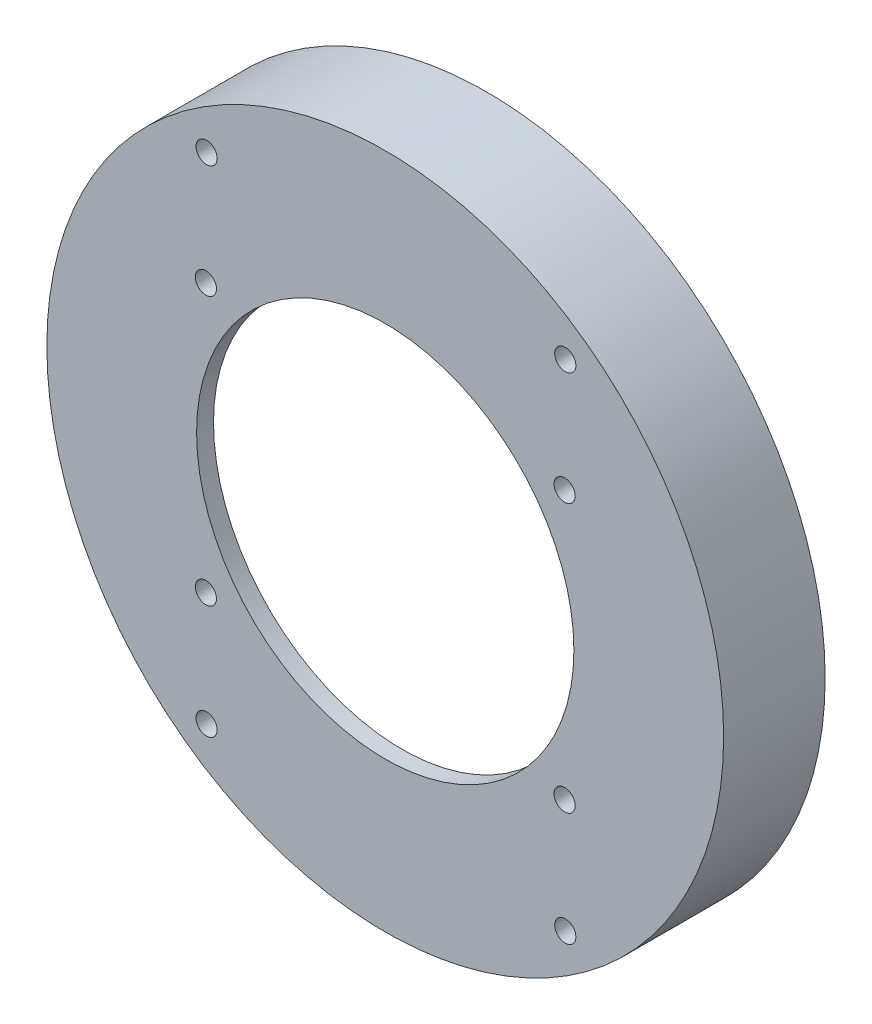
ISO-10303-21;
HEADER;
FILE_DESCRIPTION(('STEP AP214'),'2;1');
FILE_NAME('part.step','',(''),(''),'','','');
FILE_SCHEMA(('AUTOMOTIVE_DESIGN { 1 0 10303 214 1 1 1 1 }'));
ENDSEC;
DATA;
#1=APPLICATION_CONTEXT('core data for automotive mechanical design processes');
#2=APPLICATION_PROTOCOL_DEFINITION('international standard','automotive_design',2000,#1);
#3=PRODUCT_CONTEXT('',#1,'mechanical');
#4=PRODUCT('Part','Part','',(#3));
#5=PRODUCT_RELATED_PRODUCT_CATEGORY('part','',(#4));
#6=PRODUCT_DEFINITION_FORMATION('','',#4);
#7=PRODUCT_DEFINITION_CONTEXT('part definition',#1,'design');
#8=PRODUCT_DEFINITION('design','',#6,#7);
#9=PRODUCT_DEFINITION_SHAPE('','',#8);
#10=(LENGTH_UNIT() NAMED_UNIT(*) SI_UNIT(.MILLI.,.METRE.));
#11=(NAMED_UNIT(*) PLANE_ANGLE_UNIT() SI_UNIT($,.RADIAN.));
#12=(NAMED_UNIT(*) SI_UNIT($,.STERADIAN.) SOLID_ANGLE_UNIT());
#13=UNCERTAINTY_MEASURE_WITH_UNIT(LENGTH_MEASURE(1.E-05),#10,'distance_accuracy_value','');
#14=(GEOMETRIC_REPRESENTATION_CONTEXT(3) GLOBAL_UNCERTAINTY_ASSIGNED_CONTEXT((#13)) GLOBAL_UNIT_ASSIGNED_CONTEXT((#10,
#11,#12)) REPRESENTATION_CONTEXT('',''));
#15=CARTESIAN_POINT('',(0.,0.,0.));
#16=DIRECTION('',(0.,0.,1.));
#17=DIRECTION('',(1.,0.,0.));
#18=AXIS2_PLACEMENT_3D('',#15,#16,#17);
#19=CARTESIAN_POINT('',(0.,0.,25.908));
#20=DIRECTION('',(0.,0.,-1.));
#21=DIRECTION('',(-1.,0.,0.));
#22=AXIS2_PLACEMENT_3D('',#19,#20,#21);
#23=CYLINDRICAL_SURFACE('',#22,56.642);
#24=CARTESIAN_POINT('',(0.,0.,5.08));
#25=DIRECTION('',(0.,0.,1.));
#26=DIRECTION('',(1.,0.,0.));
#27=AXIS2_PLACEMENT_3D('',#24,#25,#26);
#28=CIRCLE('',#27,56.642);
#29=CARTESIAN_POINT('',(56.642,0.,5.08));
#30=VERTEX_POINT('',#29);
#31=EDGE_CURVE('E49',#30,#30,#28,.T.);
#32=ORIENTED_EDGE('',*,*,#31,.T.);
#33=EDGE_LOOP('',(#32));
#34=FACE_BOUND('',#33,.T.);
#35=CARTESIAN_POINT('',(0.,0.,0.));
#36=DIRECTION('',(0.,0.,-1.));
#37=DIRECTION('',(-1.,0.,0.));
#38=AXIS2_PLACEMENT_3D('',#35,#36,#37);
#39=CIRCLE('',#38,56.642);
#40=CARTESIAN_POINT('',(-56.642,0.,0.));
#41=VERTEX_POINT('',#40);
#42=EDGE_CURVE('E94',#41,#41,#39,.T.);
#43=ORIENTED_EDGE('',*,*,#42,.T.);
#44=EDGE_LOOP('',(#43));
#45=FACE_BOUND('',#44,.T.);
#46=ADVANCED_FACE('F40',(#34,#45),#23,.F.);
#47=CARTESIAN_POINT('',(0.,0.,5.08));
#48=DIRECTION('',(0.,0.,-1.));
#49=DIRECTION('',(-1.,0.,0.));
#50=AXIS2_PLACEMENT_3D('',#47,#48,#49);
#51=CYLINDRICAL_SURFACE('',#50,101.6);
#52=CARTESIAN_POINT('',(0.,0.,5.08));
#53=DIRECTION('',(0.,0.,1.));
#54=DIRECTION('',(1.,0.,0.));
#55=AXIS2_PLACEMENT_3D('',#52,#53,#54);
#56=CIRCLE('',#55,101.6);
#57=CARTESIAN_POINT('',(101.6,0.,5.08));
#58=VERTEX_POINT('',#57);
#59=EDGE_CURVE('E10',#58,#58,#56,.T.);
#60=ORIENTED_EDGE('',*,*,#59,.F.);
#61=EDGE_LOOP('',(#60));
#62=FACE_BOUND('',#61,.T.);
#63=CARTESIAN_POINT('',(0.,0.,-25.4));
#64=DIRECTION('',(0.,0.,-1.));
#65=DIRECTION('',(-1.,0.,0.));
#66=AXIS2_PLACEMENT_3D('',#63,#64,#65);
#67=CIRCLE('',#66,101.6);
#68=CARTESIAN_POINT('',(-101.6,0.,-25.4));
#69=VERTEX_POINT('',#68);
#70=EDGE_CURVE('E44',#69,#69,#67,.T.);
#71=ORIENTED_EDGE('',*,*,#70,.F.);
#72=EDGE_LOOP('',(#71));
#73=FACE_BOUND('',#72,.T.);
#74=ADVANCED_FACE('F39',(#62,#73),#51,.T.);
#75=CARTESIAN_POINT('',(0.,0.,5.08));
#76=DIRECTION('',(0.,0.,1.));
#77=DIRECTION('',(1.,0.,0.));
#78=AXIS2_PLACEMENT_3D('',#75,#76,#77);
#79=PLANE('',#78);
#80=CARTESIAN_POINT('',(54.0557691116327,-74.2958357456069,5.08));
#81=DIRECTION('',(0.,0.,1.));
#82=DIRECTION('',(1.,0.,0.));
#83=AXIS2_PLACEMENT_3D('',#80,#81,#82);
#84=CIRCLE('',#83,3.175);
#85=CARTESIAN_POINT('',(57.2307691116327,-74.2958357456069,5.08));
#86=VERTEX_POINT('',#85);
#87=EDGE_CURVE('E172',#86,#86,#84,.T.);
#88=ORIENTED_EDGE('',*,*,#87,.F.);
#89=EDGE_LOOP('',(#88));
#90=FACE_BOUND('',#89,.T.);
#91=CARTESIAN_POINT('',(-53.6402308883673,-74.295835745607,5.08));
#92=DIRECTION('',(0.,0.,1.));
#93=DIRECTION('',(1.,0.,0.));
#94=AXIS2_PLACEMENT_3D('',#91,#92,#93);
#95=CIRCLE('',#94,3.175);
#96=CARTESIAN_POINT('',(-50.4652308883673,-74.295835745607,5.08));
#97=VERTEX_POINT('',#96);
#98=EDGE_CURVE('E166',#97,#97,#95,.T.);
#99=ORIENTED_EDGE('',*,*,#98,.F.);
#100=EDGE_LOOP('',(#99));
#101=FACE_BOUND('',#100,.T.);
#102=CARTESIAN_POINT('',(-53.6402308883673,74.294164254393,5.08));
#103=DIRECTION('',(0.,0.,1.));
#104=DIRECTION('',(1.,0.,0.));
#105=AXIS2_PLACEMENT_3D('',#102,#103,#104);
#106=CIRCLE('',#105,3.175);
#107=CARTESIAN_POINT('',(-50.4652308883673,74.294164254393,5.08));
#108=VERTEX_POINT('',#107);
#109=EDGE_CURVE('E170',#108,#108,#106,.T.);
#110=ORIENTED_EDGE('',*,*,#109,.F.);
#111=EDGE_LOOP('',(#110));
#112=FACE_BOUND('',#111,.T.);
#113=CARTESIAN_POINT('',(54.0557691116327,74.2941642543931,5.08));
#114=DIRECTION('',(0.,0.,1.));
#115=DIRECTION('',(1.,0.,0.));
#116=AXIS2_PLACEMENT_3D('',#113,#114,#115);
#117=CIRCLE('',#116,3.175);
#118=CARTESIAN_POINT('',(57.2307691116327,74.2941642543931,5.08));
#119=VERTEX_POINT('',#118);
#120=EDGE_CURVE('E59',#119,#119,#117,.T.);
#121=ORIENTED_EDGE('',*,*,#120,.F.);
#122=EDGE_LOOP('',(#121));
#123=FACE_BOUND('',#122,.T.);
#124=CARTESIAN_POINT('',(-53.848,-40.259,5.08));
#125=DIRECTION('',(0.,0.,1.));
#126=DIRECTION('',(1.,0.,0.));
#127=AXIS2_PLACEMENT_3D('',#124,#125,#126);
#128=CIRCLE('',#127,3.175);
#129=CARTESIAN_POINT('',(-50.673,-40.259,5.08));
#130=VERTEX_POINT('',#129);
#131=EDGE_CURVE('E88',#130,#130,#128,.T.);
#132=ORIENTED_EDGE('',*,*,#131,.F.);
#133=EDGE_LOOP('',(#132));
#134=FACE_BOUND('',#133,.T.);
#135=CARTESIAN_POINT('',(53.848,-40.259,5.08));
#136=DIRECTION('',(0.,0.,1.));
#137=DIRECTION('',(1.,0.,0.));
#138=AXIS2_PLACEMENT_3D('',#135,#136,#137);
#139=CIRCLE('',#138,3.175);
#140=CARTESIAN_POINT('',(57.023,-40.259,5.08));
#141=VERTEX_POINT('',#140);
#142=EDGE_CURVE('E90',#141,#141,#139,.T.);
#143=ORIENTED_EDGE('',*,*,#142,.F.);
#144=EDGE_LOOP('',(#143));
#145=FACE_BOUND('',#144,.T.);
#146=CARTESIAN_POINT('',(53.848,40.259,5.08));
#147=DIRECTION('',(0.,0.,1.));
#148=DIRECTION('',(1.,0.,0.));
#149=AXIS2_PLACEMENT_3D('',#146,#147,#148);
#150=CIRCLE('',#149,3.175);
#151=CARTESIAN_POINT('',(57.023,40.259,5.08));
#152=VERTEX_POINT('',#151);
#153=EDGE_CURVE('E84',#152,#152,#150,.T.);
#154=ORIENTED_EDGE('',*,*,#153,.F.);
#155=EDGE_LOOP('',(#154));
#156=FACE_BOUND('',#155,.T.);
#157=CARTESIAN_POINT('',(-53.848,40.259,5.08));
#158=DIRECTION('',(0.,0.,1.));
#159=DIRECTION('',(1.,0.,0.));
#160=AXIS2_PLACEMENT_3D('',#157,#158,#159);
#161=CIRCLE('',#160,3.175);
#162=CARTESIAN_POINT('',(-50.673,40.259,5.08));
#163=VERTEX_POINT('',#162);
#164=EDGE_CURVE('E82',#163,#163,#161,.T.);
#165=ORIENTED_EDGE('',*,*,#164,.F.);
#166=EDGE_LOOP('',(#165));
#167=FACE_BOUND('',#166,.T.);
#168=ORIENTED_EDGE('',*,*,#31,.F.);
#169=EDGE_LOOP('',(#168));
#170=FACE_BOUND('',#169,.T.);
#171=ORIENTED_EDGE('',*,*,#59,.T.);
#172=EDGE_LOOP('',(#171));
#173=FACE_BOUND('',#172,.T.);
#174=ADVANCED_FACE('F108',(#90,#101,#112,#123,#134,#145,#156,#167,#170,#173),#79,.T.);
#175=CARTESIAN_POINT('',(0.,0.,-25.4));
#176=DIRECTION('',(0.,0.,-1.));
#177=DIRECTION('',(-1.,0.,0.));
#178=AXIS2_PLACEMENT_3D('',#175,#176,#177);
#179=PLANE('',#178);
#180=CARTESIAN_POINT('',(0.,0.,-25.4));
#181=DIRECTION('',(0.,0.,-1.));
#182=DIRECTION('',(-1.,0.,0.));
#183=AXIS2_PLACEMENT_3D('',#180,#181,#182);
#184=CIRCLE('',#183,98.425);
#185=CARTESIAN_POINT('',(-98.425,0.,-25.4));
#186=VERTEX_POINT('',#185);
#187=EDGE_CURVE('E98',#186,#186,#184,.T.);
#188=ORIENTED_EDGE('',*,*,#187,.F.);
#189=EDGE_LOOP('',(#188));
#190=FACE_BOUND('',#189,.T.);
#191=ORIENTED_EDGE('',*,*,#70,.T.);
#192=EDGE_LOOP('',(#191));
#193=FACE_BOUND('',#192,.T.);
#194=ADVANCED_FACE('F106',(#190,#193),#179,.T.);
#195=CARTESIAN_POINT('',(0.,0.,0.));
#196=DIRECTION('',(0.,0.,-1.));
#197=DIRECTION('',(-1.,0.,0.));
#198=AXIS2_PLACEMENT_3D('',#195,#196,#197);
#199=CYLINDRICAL_SURFACE('',#198,98.425);
#200=CARTESIAN_POINT('',(0.,0.,0.));
#201=DIRECTION('',(0.,0.,-1.));
#202=DIRECTION('',(-1.,0.,0.));
#203=AXIS2_PLACEMENT_3D('',#200,#201,#202);
#204=CIRCLE('',#203,98.425);
#205=CARTESIAN_POINT('',(-98.425,0.,0.));
#206=VERTEX_POINT('',#205);
#207=EDGE_CURVE('E100',#206,#206,#204,.T.);
#208=ORIENTED_EDGE('',*,*,#207,.F.);
#209=EDGE_LOOP('',(#208));
#210=FACE_BOUND('',#209,.T.);
#211=ORIENTED_EDGE('',*,*,#187,.T.);
#212=EDGE_LOOP('',(#211));
#213=FACE_BOUND('',#212,.T.);
#214=ADVANCED_FACE('F112',(#210,#213),#199,.F.);
#215=CARTESIAN_POINT('',(0.,0.,0.));
#216=DIRECTION('',(0.,0.,-1.));
#217=DIRECTION('',(-1.,0.,0.));
#218=AXIS2_PLACEMENT_3D('',#215,#216,#217);
#219=PLANE('',#218);
#220=CARTESIAN_POINT('',(54.0557691116327,-74.2958357456069,0.));
#221=DIRECTION('',(0.,0.,-1.));
#222=DIRECTION('',(-1.,0.,0.));
#223=AXIS2_PLACEMENT_3D('',#220,#221,#222);
#224=CIRCLE('',#223,3.175);
#225=CARTESIAN_POINT('',(50.8807691116327,-74.2958357456069,0.));
#226=VERTEX_POINT('',#225);
#227=EDGE_CURVE('E41',#226,#226,#224,.T.);
#228=ORIENTED_EDGE('',*,*,#227,.F.);
#229=EDGE_LOOP('',(#228));
#230=FACE_BOUND('',#229,.T.);
#231=CARTESIAN_POINT('',(-53.6402308883673,-74.295835745607,0.));
#232=DIRECTION('',(0.,0.,-1.));
#233=DIRECTION('',(-1.,0.,0.));
#234=AXIS2_PLACEMENT_3D('',#231,#232,#233);
#235=CIRCLE('',#234,3.175);
#236=CARTESIAN_POINT('',(-56.8152308883673,-74.295835745607,0.));
#237=VERTEX_POINT('',#236);
#238=EDGE_CURVE('E58',#237,#237,#235,.T.);
#239=ORIENTED_EDGE('',*,*,#238,.F.);
#240=EDGE_LOOP('',(#239));
#241=FACE_BOUND('',#240,.T.);
#242=CARTESIAN_POINT('',(-53.6402308883673,74.294164254393,0.));
#243=DIRECTION('',(0.,0.,-1.));
#244=DIRECTION('',(-1.,0.,0.));
#245=AXIS2_PLACEMENT_3D('',#242,#243,#244);
#246=CIRCLE('',#245,3.175);
#247=CARTESIAN_POINT('',(-56.8152308883673,74.294164254393,0.));
#248=VERTEX_POINT('',#247);
#249=EDGE_CURVE('E60',#248,#248,#246,.T.);
#250=ORIENTED_EDGE('',*,*,#249,.F.);
#251=EDGE_LOOP('',(#250));
#252=FACE_BOUND('',#251,.T.);
#253=CARTESIAN_POINT('',(54.0557691116327,74.2941642543931,0.));
#254=DIRECTION('',(0.,0.,-1.));
#255=DIRECTION('',(-1.,0.,0.));
#256=AXIS2_PLACEMENT_3D('',#253,#254,#255);
#257=CIRCLE('',#256,3.175);
#258=CARTESIAN_POINT('',(50.8807691116327,74.2941642543931,0.));
#259=VERTEX_POINT('',#258);
#260=EDGE_CURVE('E53',#259,#259,#257,.T.);
#261=ORIENTED_EDGE('',*,*,#260,.F.);
#262=EDGE_LOOP('',(#261));
#263=FACE_BOUND('',#262,.T.);
#264=CARTESIAN_POINT('',(-53.848,-40.259,0.));
#265=DIRECTION('',(0.,0.,-1.));
#266=DIRECTION('',(-1.,0.,0.));
#267=AXIS2_PLACEMENT_3D('',#264,#265,#266);
#268=CIRCLE('',#267,3.175);
#269=CARTESIAN_POINT('',(-57.023,-40.259,0.));
#270=VERTEX_POINT('',#269);
#271=EDGE_CURVE('E63',#270,#270,#268,.T.);
#272=ORIENTED_EDGE('',*,*,#271,.F.);
#273=EDGE_LOOP('',(#272));
#274=FACE_BOUND('',#273,.T.);
#275=CARTESIAN_POINT('',(53.848,-40.259,0.));
#276=DIRECTION('',(0.,0.,-1.));
#277=DIRECTION('',(-1.,0.,0.));
#278=AXIS2_PLACEMENT_3D('',#275,#276,#277);
#279=CIRCLE('',#278,3.175);
#280=CARTESIAN_POINT('',(50.673,-40.259,0.));
#281=VERTEX_POINT('',#280);
#282=EDGE_CURVE('E66',#281,#281,#279,.T.);
#283=ORIENTED_EDGE('',*,*,#282,.F.);
#284=EDGE_LOOP('',(#283));
#285=FACE_BOUND('',#284,.T.);
#286=CARTESIAN_POINT('',(53.848,40.259,0.));
#287=DIRECTION('',(0.,0.,-1.));
#288=DIRECTION('',(-1.,0.,0.));
#289=AXIS2_PLACEMENT_3D('',#286,#287,#288);
#290=CIRCLE('',#289,3.175);
#291=CARTESIAN_POINT('',(50.673,40.259,0.));
#292=VERTEX_POINT('',#291);
#293=EDGE_CURVE('E72',#292,#292,#290,.T.);
#294=ORIENTED_EDGE('',*,*,#293,.F.);
#295=EDGE_LOOP('',(#294));
#296=FACE_BOUND('',#295,.T.);
#297=CARTESIAN_POINT('',(-53.848,40.259,0.));
#298=DIRECTION('',(0.,0.,-1.));
#299=DIRECTION('',(-1.,0.,0.));
#300=AXIS2_PLACEMENT_3D('',#297,#298,#299);
#301=CIRCLE('',#300,3.175);
#302=CARTESIAN_POINT('',(-57.023,40.259,0.));
#303=VERTEX_POINT('',#302);
#304=EDGE_CURVE('E79',#303,#303,#301,.T.);
#305=ORIENTED_EDGE('',*,*,#304,.F.);
#306=EDGE_LOOP('',(#305));
#307=FACE_BOUND('',#306,.T.);
#308=ORIENTED_EDGE('',*,*,#42,.F.);
#309=EDGE_LOOP('',(#308));
#310=FACE_BOUND('',#309,.T.);
#311=ORIENTED_EDGE('',*,*,#207,.T.);
#312=EDGE_LOOP('',(#311));
#313=FACE_BOUND('',#312,.T.);
#314=ADVANCED_FACE('F128',(#230,#241,#252,#263,#274,#285,#296,#307,#310,#313),#219,.T.);
#315=CARTESIAN_POINT('',(-53.848,40.259,6.35));
#316=DIRECTION('',(0.,0.,-1.));
#317=DIRECTION('',(-1.,0.,0.));
#318=AXIS2_PLACEMENT_3D('',#315,#316,#317);
#319=CYLINDRICAL_SURFACE('',#318,3.175);
#320=ORIENTED_EDGE('',*,*,#164,.T.);
#321=EDGE_LOOP('',(#320));
#322=FACE_BOUND('',#321,.T.);
#323=ORIENTED_EDGE('',*,*,#304,.T.);
#324=EDGE_LOOP('',(#323));
#325=FACE_BOUND('',#324,.T.);
#326=ADVANCED_FACE('F135',(#322,#325),#319,.F.);
#327=CARTESIAN_POINT('',(53.848,40.259,6.35));
#328=DIRECTION('',(0.,0.,-1.));
#329=DIRECTION('',(-1.,0.,0.));
#330=AXIS2_PLACEMENT_3D('',#327,#328,#329);
#331=CYLINDRICAL_SURFACE('',#330,3.175);
#332=ORIENTED_EDGE('',*,*,#153,.T.);
#333=EDGE_LOOP('',(#332));
#334=FACE_BOUND('',#333,.T.);
#335=ORIENTED_EDGE('',*,*,#293,.T.);
#336=EDGE_LOOP('',(#335));
#337=FACE_BOUND('',#336,.T.);
#338=ADVANCED_FACE('F137',(#334,#337),#331,.F.);
#339=CARTESIAN_POINT('',(53.848,-40.259,6.35));
#340=DIRECTION('',(0.,0.,-1.));
#341=DIRECTION('',(-1.,0.,0.));
#342=AXIS2_PLACEMENT_3D('',#339,#340,#341);
#343=CYLINDRICAL_SURFACE('',#342,3.175);
#344=ORIENTED_EDGE('',*,*,#142,.T.);
#345=EDGE_LOOP('',(#344));
#346=FACE_BOUND('',#345,.T.);
#347=ORIENTED_EDGE('',*,*,#282,.T.);
#348=EDGE_LOOP('',(#347));
#349=FACE_BOUND('',#348,.T.);
#350=ADVANCED_FACE('F142',(#346,#349),#343,.F.);
#351=CARTESIAN_POINT('',(-53.848,-40.259,6.35));
#352=DIRECTION('',(0.,0.,-1.));
#353=DIRECTION('',(-1.,0.,0.));
#354=AXIS2_PLACEMENT_3D('',#351,#352,#353);
#355=CYLINDRICAL_SURFACE('',#354,3.175);
#356=ORIENTED_EDGE('',*,*,#131,.T.);
#357=EDGE_LOOP('',(#356));
#358=FACE_BOUND('',#357,.T.);
#359=ORIENTED_EDGE('',*,*,#271,.T.);
#360=EDGE_LOOP('',(#359));
#361=FACE_BOUND('',#360,.T.);
#362=ADVANCED_FACE('F139',(#358,#361),#355,.F.);
#363=CARTESIAN_POINT('',(54.0557691116327,74.2941642543931,-2.79399999999999));
#364=DIRECTION('',(0.,0.,1.));
#365=DIRECTION('',(1.,0.,0.));
#366=AXIS2_PLACEMENT_3D('',#363,#364,#365);
#367=CYLINDRICAL_SURFACE('',#366,3.175);
#368=ORIENTED_EDGE('',*,*,#260,.T.);
#369=EDGE_LOOP('',(#368));
#370=FACE_BOUND('',#369,.T.);
#371=ORIENTED_EDGE('',*,*,#120,.T.);
#372=EDGE_LOOP('',(#371));
#373=FACE_BOUND('',#372,.T.);
#374=ADVANCED_FACE('F138',(#370,#373),#367,.F.);
#375=CARTESIAN_POINT('',(-53.6402308883673,74.294164254393,-2.79399999999999));
#376=DIRECTION('',(0.,0.,1.));
#377=DIRECTION('',(1.,0.,0.));
#378=AXIS2_PLACEMENT_3D('',#375,#376,#377);
#379=CYLINDRICAL_SURFACE('',#378,3.175);
#380=ORIENTED_EDGE('',*,*,#249,.T.);
#381=EDGE_LOOP('',(#380));
#382=FACE_BOUND('',#381,.T.);
#383=ORIENTED_EDGE('',*,*,#109,.T.);
#384=EDGE_LOOP('',(#383));
#385=FACE_BOUND('',#384,.T.);
#386=ADVANCED_FACE('F152',(#382,#385),#379,.F.);
#387=CARTESIAN_POINT('',(-53.6402308883673,-74.295835745607,-2.79399999999999));
#388=DIRECTION('',(0.,0.,1.));
#389=DIRECTION('',(1.,0.,0.));
#390=AXIS2_PLACEMENT_3D('',#387,#388,#389);
#391=CYLINDRICAL_SURFACE('',#390,3.175);
#392=ORIENTED_EDGE('',*,*,#238,.T.);
#393=EDGE_LOOP('',(#392));
#394=FACE_BOUND('',#393,.T.);
#395=ORIENTED_EDGE('',*,*,#98,.T.);
#396=EDGE_LOOP('',(#395));
#397=FACE_BOUND('',#396,.T.);
#398=ADVANCED_FACE('F157',(#394,#397),#391,.F.);
#399=CARTESIAN_POINT('',(54.0557691116327,-74.2958357456069,-2.79399999999999));
#400=DIRECTION('',(0.,0.,1.));
#401=DIRECTION('',(1.,0.,0.));
#402=AXIS2_PLACEMENT_3D('',#399,#400,#401);
#403=CYLINDRICAL_SURFACE('',#402,3.175);
#404=ORIENTED_EDGE('',*,*,#227,.T.);
#405=EDGE_LOOP('',(#404));
#406=FACE_BOUND('',#405,.T.);
#407=ORIENTED_EDGE('',*,*,#87,.T.);
#408=EDGE_LOOP('',(#407));
#409=FACE_BOUND('',#408,.T.);
#410=ADVANCED_FACE('F154',(#406,#409),#403,.F.);
#411=CLOSED_SHELL('',(#46,#74,#174,#194,#214,#314,#326,#338,#350,#362,#374,#386,#398,#410));
#412=MANIFOLD_SOLID_BREP('B2',#411);
#413=ADVANCED_BREP_SHAPE_REPRESENTATION('',(#18,#412),#14);
#414=SHAPE_DEFINITION_REPRESENTATION(#9,#413);
ENDSEC;
END-ISO-10303-21;
